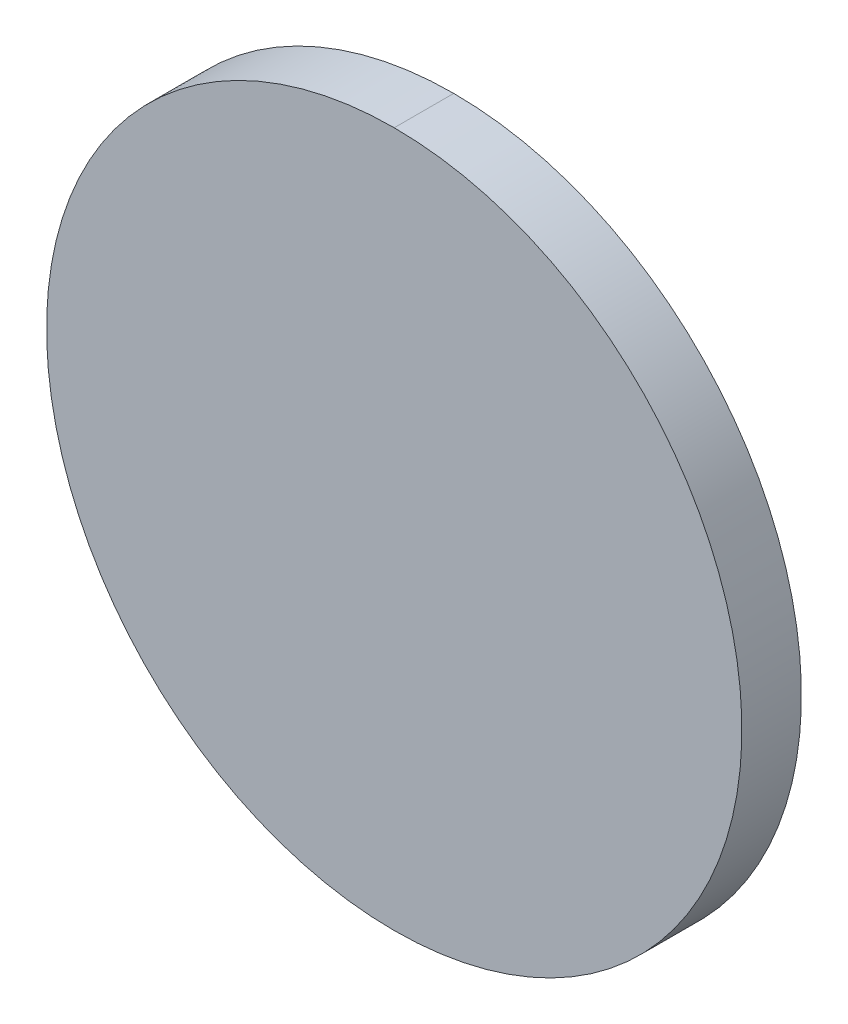
ISO-10303-21;
HEADER;
FILE_DESCRIPTION(('STEP AP214'),'2;1');
FILE_NAME('part.step','',(''),(''),'','','');
FILE_SCHEMA(('AUTOMOTIVE_DESIGN { 1 0 10303 214 1 1 1 1 }'));
ENDSEC;
DATA;
#1=APPLICATION_CONTEXT('core data for automotive mechanical design processes');
#2=APPLICATION_PROTOCOL_DEFINITION('international standard','automotive_design',2000,#1);
#3=PRODUCT_CONTEXT('',#1,'mechanical');
#4=PRODUCT('Part','Part','',(#3));
#5=PRODUCT_RELATED_PRODUCT_CATEGORY('part','',(#4));
#6=PRODUCT_DEFINITION_FORMATION('','',#4);
#7=PRODUCT_DEFINITION_CONTEXT('part definition',#1,'design');
#8=PRODUCT_DEFINITION('design','',#6,#7);
#9=PRODUCT_DEFINITION_SHAPE('','',#8);
#10=(LENGTH_UNIT() NAMED_UNIT(*) SI_UNIT(.MILLI.,.METRE.));
#11=(NAMED_UNIT(*) PLANE_ANGLE_UNIT() SI_UNIT($,.RADIAN.));
#12=(NAMED_UNIT(*) SI_UNIT($,.STERADIAN.) SOLID_ANGLE_UNIT());
#13=UNCERTAINTY_MEASURE_WITH_UNIT(LENGTH_MEASURE(1.E-05),#10,'distance_accuracy_value','');
#14=(GEOMETRIC_REPRESENTATION_CONTEXT(3) GLOBAL_UNCERTAINTY_ASSIGNED_CONTEXT((#13)) GLOBAL_UNIT_ASSIGNED_CONTEXT((#10,
#11,#12)) REPRESENTATION_CONTEXT('',''));
#15=CARTESIAN_POINT('',(0.,0.,0.));
#16=DIRECTION('',(0.,0.,1.));
#17=DIRECTION('',(1.,0.,0.));
#18=AXIS2_PLACEMENT_3D('',#15,#16,#17);
#19=CARTESIAN_POINT('',(0.,0.,0.0762));
#20=DIRECTION('',(0.,0.,1.));
#21=DIRECTION('',(1.,0.,0.));
#22=AXIS2_PLACEMENT_3D('',#19,#20,#21);
#23=PLANE('',#22);
#24=CARTESIAN_POINT('',(0.,0.,0.0762));
#25=DIRECTION('',(0.,0.,1.));
#26=DIRECTION('',(0.,1.,0.));
#27=AXIS2_PLACEMENT_3D('',#24,#25,#26);
#28=CIRCLE('',#27,0.445);
#29=CARTESIAN_POINT('',(0.,0.445,0.0762));
#30=VERTEX_POINT('',#29);
#31=CARTESIAN_POINT('',(0.,-0.445,0.0762));
#32=VERTEX_POINT('',#31);
#33=EDGE_CURVE('E11',#30,#32,#28,.T.);
#34=ORIENTED_EDGE('',*,*,#33,.T.);
#35=CARTESIAN_POINT('',(0.,0.,0.0762));
#36=DIRECTION('',(0.,0.,1.));
#37=DIRECTION('',(0.,-1.,0.));
#38=AXIS2_PLACEMENT_3D('',#35,#36,#37);
#39=CIRCLE('',#38,0.445);
#40=EDGE_CURVE('E21',#32,#30,#39,.T.);
#41=ORIENTED_EDGE('',*,*,#40,.T.);
#42=EDGE_LOOP('',(#34,#41));
#43=FACE_BOUND('',#42,.T.);
#44=ADVANCED_FACE('F18',(#43),#23,.T.);
#45=CARTESIAN_POINT('',(0.,0.,0.));
#46=DIRECTION('',(0.,0.,1.));
#47=DIRECTION('',(0.,-1.,0.));
#48=AXIS2_PLACEMENT_3D('',#45,#46,#47);
#49=CYLINDRICAL_SURFACE('',#48,0.445);
#50=DIRECTION('',(0.,0.,1.));
#51=VECTOR('',#50,1.);
#52=CARTESIAN_POINT('',(0.,-0.445,0.));
#53=LINE('',#52,#51);
#54=CARTESIAN_POINT('',(0.,-0.445,0.));
#55=VERTEX_POINT('',#54);
#56=EDGE_CURVE('E28',#55,#32,#53,.T.);
#57=ORIENTED_EDGE('',*,*,#56,.T.);
#58=ORIENTED_EDGE('',*,*,#33,.F.);
#59=DIRECTION('',(0.,0.,1.));
#60=VECTOR('',#59,1.);
#61=CARTESIAN_POINT('',(0.,0.445,0.));
#62=LINE('',#61,#60);
#63=CARTESIAN_POINT('',(0.,0.445,0.));
#64=VERTEX_POINT('',#63);
#65=EDGE_CURVE('E49',#64,#30,#62,.T.);
#66=ORIENTED_EDGE('',*,*,#65,.F.);
#67=CARTESIAN_POINT('',(0.,0.,0.));
#68=DIRECTION('',(0.,0.,1.));
#69=DIRECTION('',(0.,1.,0.));
#70=AXIS2_PLACEMENT_3D('',#67,#68,#69);
#71=CIRCLE('',#70,0.445);
#72=EDGE_CURVE('E63',#64,#55,#71,.T.);
#73=ORIENTED_EDGE('',*,*,#72,.T.);
#74=EDGE_LOOP('',(#57,#58,#66,#73));
#75=FACE_BOUND('',#74,.T.);
#76=ADVANCED_FACE('F66',(#75),#49,.T.);
#77=CARTESIAN_POINT('',(0.,0.,0.));
#78=DIRECTION('',(0.,0.,1.));
#79=DIRECTION('',(0.,-1.,0.));
#80=AXIS2_PLACEMENT_3D('',#77,#78,#79);
#81=CYLINDRICAL_SURFACE('',#80,0.445);
#82=ORIENTED_EDGE('',*,*,#65,.T.);
#83=ORIENTED_EDGE('',*,*,#40,.F.);
#84=ORIENTED_EDGE('',*,*,#56,.F.);
#85=CARTESIAN_POINT('',(0.,0.,0.));
#86=DIRECTION('',(0.,0.,1.));
#87=DIRECTION('',(0.,-1.,0.));
#88=AXIS2_PLACEMENT_3D('',#85,#86,#87);
#89=CIRCLE('',#88,0.445);
#90=EDGE_CURVE('E58',#55,#64,#89,.T.);
#91=ORIENTED_EDGE('',*,*,#90,.T.);
#92=EDGE_LOOP('',(#82,#83,#84,#91));
#93=FACE_BOUND('',#92,.T.);
#94=ADVANCED_FACE('F57',(#93),#81,.T.);
#95=CARTESIAN_POINT('',(0.,0.,0.));
#96=DIRECTION('',(0.,0.,1.));
#97=DIRECTION('',(1.,0.,0.));
#98=AXIS2_PLACEMENT_3D('',#95,#96,#97);
#99=PLANE('',#98);
#100=ORIENTED_EDGE('',*,*,#72,.F.);
#101=ORIENTED_EDGE('',*,*,#90,.F.);
#102=EDGE_LOOP('',(#100,#101));
#103=FACE_BOUND('',#102,.T.);
#104=ADVANCED_FACE('F62',(#103),#99,.F.);
#105=CLOSED_SHELL('',(#44,#76,#94,#104));
#106=MANIFOLD_SOLID_BREP('B1',#105);
#107=ADVANCED_BREP_SHAPE_REPRESENTATION('',(#18,#106),#14);
#108=SHAPE_DEFINITION_REPRESENTATION(#9,#107);
ENDSEC;
END-ISO-10303-21;
